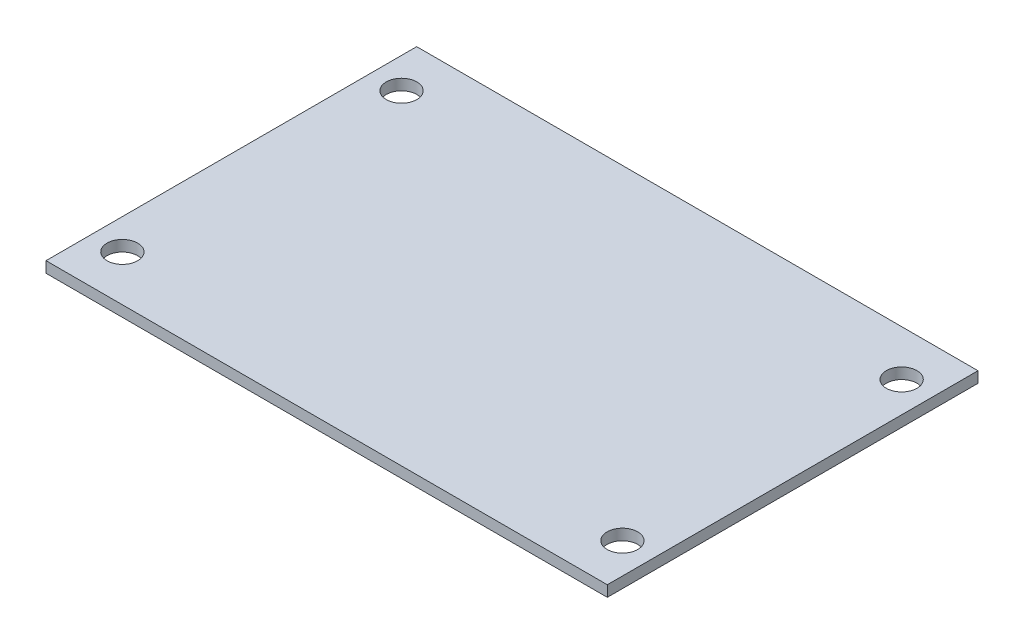
ISO-10303-21;
HEADER;
FILE_DESCRIPTION(('STEP AP214'),'2;1');
FILE_NAME('part.step','',(''),(''),'','','');
FILE_SCHEMA(('AUTOMOTIVE_DESIGN { 1 0 10303 214 1 1 1 1 }'));
ENDSEC;
DATA;
#1=APPLICATION_CONTEXT('core data for automotive mechanical design processes');
#2=APPLICATION_PROTOCOL_DEFINITION('international standard','automotive_design',2000,#1);
#3=PRODUCT_CONTEXT('',#1,'mechanical');
#4=PRODUCT('Part','Part','',(#3));
#5=PRODUCT_RELATED_PRODUCT_CATEGORY('part','',(#4));
#6=PRODUCT_DEFINITION_FORMATION('','',#4);
#7=PRODUCT_DEFINITION_CONTEXT('part definition',#1,'design');
#8=PRODUCT_DEFINITION('design','',#6,#7);
#9=PRODUCT_DEFINITION_SHAPE('','',#8);
#10=(LENGTH_UNIT() NAMED_UNIT(*) SI_UNIT(.MILLI.,.METRE.));
#11=(NAMED_UNIT(*) PLANE_ANGLE_UNIT() SI_UNIT($,.RADIAN.));
#12=(NAMED_UNIT(*) SI_UNIT($,.STERADIAN.) SOLID_ANGLE_UNIT());
#13=UNCERTAINTY_MEASURE_WITH_UNIT(LENGTH_MEASURE(1.E-05),#10,'distance_accuracy_value','');
#14=(GEOMETRIC_REPRESENTATION_CONTEXT(3) GLOBAL_UNCERTAINTY_ASSIGNED_CONTEXT((#13)) GLOBAL_UNIT_ASSIGNED_CONTEXT((#10,
#11,#12)) REPRESENTATION_CONTEXT('',''));
#15=CARTESIAN_POINT('',(0.,0.,0.));
#16=DIRECTION('',(0.,0.,1.));
#17=DIRECTION('',(1.,0.,0.));
#18=AXIS2_PLACEMENT_3D('',#15,#16,#17);
#19=CARTESIAN_POINT('',(38.5,1.5,-25.425));
#20=DIRECTION('',(-1.,0.,0.));
#21=DIRECTION('',(0.,0.,1.));
#22=AXIS2_PLACEMENT_3D('',#19,#20,#21);
#23=PLANE('',#22);
#24=DIRECTION('',(0.,0.,-1.));
#25=VECTOR('',#24,1.);
#26=CARTESIAN_POINT('',(38.5,0.,-25.425));
#27=LINE('',#26,#25);
#28=CARTESIAN_POINT('',(38.5,0.,25.425));
#29=VERTEX_POINT('',#28);
#30=CARTESIAN_POINT('',(38.5,0.,-25.425));
#31=VERTEX_POINT('',#30);
#32=EDGE_CURVE('E98',#29,#31,#27,.T.);
#33=ORIENTED_EDGE('',*,*,#32,.T.);
#34=DIRECTION('',(0.,-1.,0.));
#35=VECTOR('',#34,1.);
#36=CARTESIAN_POINT('',(38.5,1.5,-25.425));
#37=LINE('',#36,#35);
#38=CARTESIAN_POINT('',(38.5,1.5,-25.425));
#39=VERTEX_POINT('',#38);
#40=EDGE_CURVE('E11',#39,#31,#37,.T.);
#41=ORIENTED_EDGE('',*,*,#40,.F.);
#42=DIRECTION('',(0.,0.,-1.));
#43=VECTOR('',#42,1.);
#44=CARTESIAN_POINT('',(38.5,1.5,-25.425));
#45=LINE('',#44,#43);
#46=CARTESIAN_POINT('',(38.5,1.5,25.425));
#47=VERTEX_POINT('',#46);
#48=EDGE_CURVE('E86',#47,#39,#45,.T.);
#49=ORIENTED_EDGE('',*,*,#48,.F.);
#50=DIRECTION('',(0.,-1.,0.));
#51=VECTOR('',#50,1.);
#52=CARTESIAN_POINT('',(38.5,1.5,25.425));
#53=LINE('',#52,#51);
#54=EDGE_CURVE('E94',#47,#29,#53,.T.);
#55=ORIENTED_EDGE('',*,*,#54,.T.);
#56=EDGE_LOOP('',(#33,#41,#49,#55));
#57=FACE_BOUND('',#56,.T.);
#58=ADVANCED_FACE('F35',(#57),#23,.F.);
#59=CARTESIAN_POINT('',(-38.5,1.5,-25.425));
#60=DIRECTION('',(0.,0.,1.));
#61=DIRECTION('',(1.,0.,0.));
#62=AXIS2_PLACEMENT_3D('',#59,#60,#61);
#63=PLANE('',#62);
#64=DIRECTION('',(-1.,0.,0.));
#65=VECTOR('',#64,1.);
#66=CARTESIAN_POINT('',(-38.5,0.,-25.425));
#67=LINE('',#66,#65);
#68=CARTESIAN_POINT('',(-38.5,0.,-25.425));
#69=VERTEX_POINT('',#68);
#70=EDGE_CURVE('E90',#31,#69,#67,.T.);
#71=ORIENTED_EDGE('',*,*,#70,.T.);
#72=DIRECTION('',(0.,-1.,0.));
#73=VECTOR('',#72,1.);
#74=CARTESIAN_POINT('',(-38.5,1.5,-25.425));
#75=LINE('',#74,#73);
#76=CARTESIAN_POINT('',(-38.5,1.5,-25.425));
#77=VERTEX_POINT('',#76);
#78=EDGE_CURVE('E43',#77,#69,#75,.T.);
#79=ORIENTED_EDGE('',*,*,#78,.F.);
#80=DIRECTION('',(-1.,0.,0.));
#81=VECTOR('',#80,1.);
#82=CARTESIAN_POINT('',(-38.5,1.5,-25.425));
#83=LINE('',#82,#81);
#84=EDGE_CURVE('E81',#39,#77,#83,.T.);
#85=ORIENTED_EDGE('',*,*,#84,.F.);
#86=ORIENTED_EDGE('',*,*,#40,.T.);
#87=EDGE_LOOP('',(#71,#79,#85,#86));
#88=FACE_BOUND('',#87,.T.);
#89=ADVANCED_FACE('F89',(#88),#63,.F.);
#90=CARTESIAN_POINT('',(-38.5,1.5,-25.425));
#91=DIRECTION('',(1.,0.,0.));
#92=DIRECTION('',(0.,0.,-1.));
#93=AXIS2_PLACEMENT_3D('',#90,#91,#92);
#94=PLANE('',#93);
#95=DIRECTION('',(0.,0.,1.));
#96=VECTOR('',#95,1.);
#97=CARTESIAN_POINT('',(-38.5,0.,-25.425));
#98=LINE('',#97,#96);
#99=CARTESIAN_POINT('',(-38.5,0.,25.425));
#100=VERTEX_POINT('',#99);
#101=EDGE_CURVE('E68',#69,#100,#98,.T.);
#102=ORIENTED_EDGE('',*,*,#101,.T.);
#103=DIRECTION('',(0.,-1.,0.));
#104=VECTOR('',#103,1.);
#105=CARTESIAN_POINT('',(-38.5,1.5,25.425));
#106=LINE('',#105,#104);
#107=CARTESIAN_POINT('',(-38.5,1.5,25.425));
#108=VERTEX_POINT('',#107);
#109=EDGE_CURVE('E91',#108,#100,#106,.T.);
#110=ORIENTED_EDGE('',*,*,#109,.F.);
#111=DIRECTION('',(0.,0.,1.));
#112=VECTOR('',#111,1.);
#113=CARTESIAN_POINT('',(-38.5,1.5,-25.425));
#114=LINE('',#113,#112);
#115=EDGE_CURVE('E84',#77,#108,#114,.T.);
#116=ORIENTED_EDGE('',*,*,#115,.F.);
#117=ORIENTED_EDGE('',*,*,#78,.T.);
#118=EDGE_LOOP('',(#102,#110,#116,#117));
#119=FACE_BOUND('',#118,.T.);
#120=ADVANCED_FACE('F92',(#119),#94,.F.);
#121=CARTESIAN_POINT('',(-38.5,1.5,25.425));
#122=DIRECTION('',(0.,0.,-1.));
#123=DIRECTION('',(-1.,0.,0.));
#124=AXIS2_PLACEMENT_3D('',#121,#122,#123);
#125=PLANE('',#124);
#126=DIRECTION('',(1.,0.,0.));
#127=VECTOR('',#126,1.);
#128=CARTESIAN_POINT('',(-38.5,0.,25.425));
#129=LINE('',#128,#127);
#130=EDGE_CURVE('E74',#100,#29,#129,.T.);
#131=ORIENTED_EDGE('',*,*,#130,.T.);
#132=ORIENTED_EDGE('',*,*,#54,.F.);
#133=DIRECTION('',(1.,0.,0.));
#134=VECTOR('',#133,1.);
#135=CARTESIAN_POINT('',(-38.5,1.5,25.425));
#136=LINE('',#135,#134);
#137=EDGE_CURVE('E51',#108,#47,#136,.T.);
#138=ORIENTED_EDGE('',*,*,#137,.F.);
#139=ORIENTED_EDGE('',*,*,#109,.T.);
#140=EDGE_LOOP('',(#131,#132,#138,#139));
#141=FACE_BOUND('',#140,.T.);
#142=ADVANCED_FACE('F106',(#141),#125,.F.);
#143=CARTESIAN_POINT('',(0.,1.5,0.));
#144=DIRECTION('',(0.,1.,0.));
#145=DIRECTION('',(0.,0.,1.));
#146=AXIS2_PLACEMENT_3D('',#143,#144,#145);
#147=PLANE('',#146);
#148=CARTESIAN_POINT('',(-34.3,1.5,19.15));
#149=DIRECTION('',(0.,1.,0.));
#150=DIRECTION('',(0.,0.,1.));
#151=AXIS2_PLACEMENT_3D('',#148,#149,#150);
#152=CIRCLE('',#151,2.1);
#153=CARTESIAN_POINT('',(-34.3,1.5,21.25));
#154=VERTEX_POINT('',#153);
#155=EDGE_CURVE('E118',#154,#154,#152,.T.);
#156=ORIENTED_EDGE('',*,*,#155,.F.);
#157=EDGE_LOOP('',(#156));
#158=FACE_BOUND('',#157,.T.);
#159=CARTESIAN_POINT('',(34.3,1.5,19.15));
#160=DIRECTION('',(0.,1.,0.));
#161=DIRECTION('',(0.,0.,1.));
#162=AXIS2_PLACEMENT_3D('',#159,#160,#161);
#163=CIRCLE('',#162,2.1);
#164=CARTESIAN_POINT('',(34.3,1.5,21.25));
#165=VERTEX_POINT('',#164);
#166=EDGE_CURVE('E124',#165,#165,#163,.T.);
#167=ORIENTED_EDGE('',*,*,#166,.F.);
#168=EDGE_LOOP('',(#167));
#169=FACE_BOUND('',#168,.T.);
#170=CARTESIAN_POINT('',(34.3,1.5,-19.15));
#171=DIRECTION('',(0.,1.,0.));
#172=DIRECTION('',(0.,0.,1.));
#173=AXIS2_PLACEMENT_3D('',#170,#171,#172);
#174=CIRCLE('',#173,2.1);
#175=CARTESIAN_POINT('',(34.3,1.5,-17.05));
#176=VERTEX_POINT('',#175);
#177=EDGE_CURVE('E130',#176,#176,#174,.T.);
#178=ORIENTED_EDGE('',*,*,#177,.F.);
#179=EDGE_LOOP('',(#178));
#180=FACE_BOUND('',#179,.T.);
#181=CARTESIAN_POINT('',(-34.3,1.5,-19.15));
#182=DIRECTION('',(0.,1.,0.));
#183=DIRECTION('',(0.,0.,1.));
#184=AXIS2_PLACEMENT_3D('',#181,#182,#183);
#185=CIRCLE('',#184,2.1);
#186=CARTESIAN_POINT('',(-34.3,1.5,-17.05));
#187=VERTEX_POINT('',#186);
#188=EDGE_CURVE('E112',#187,#187,#185,.T.);
#189=ORIENTED_EDGE('',*,*,#188,.F.);
#190=EDGE_LOOP('',(#189));
#191=FACE_BOUND('',#190,.T.);
#192=ORIENTED_EDGE('',*,*,#48,.T.);
#193=ORIENTED_EDGE('',*,*,#84,.T.);
#194=ORIENTED_EDGE('',*,*,#115,.T.);
#195=ORIENTED_EDGE('',*,*,#137,.T.);
#196=EDGE_LOOP('',(#192,#193,#194,#195));
#197=FACE_BOUND('',#196,.T.);
#198=ADVANCED_FACE('F82',(#158,#169,#180,#191,#197),#147,.T.);
#199=CARTESIAN_POINT('',(0.,0.,0.));
#200=DIRECTION('',(0.,1.,0.));
#201=DIRECTION('',(0.,0.,1.));
#202=AXIS2_PLACEMENT_3D('',#199,#200,#201);
#203=PLANE('',#202);
#204=CARTESIAN_POINT('',(-34.3,0.,19.15));
#205=DIRECTION('',(0.,1.,0.));
#206=DIRECTION('',(0.,0.,1.));
#207=AXIS2_PLACEMENT_3D('',#204,#205,#206);
#208=CIRCLE('',#207,2.1);
#209=CARTESIAN_POINT('',(-34.3,0.,21.25));
#210=VERTEX_POINT('',#209);
#211=EDGE_CURVE('E121',#210,#210,#208,.T.);
#212=ORIENTED_EDGE('',*,*,#211,.T.);
#213=EDGE_LOOP('',(#212));
#214=FACE_BOUND('',#213,.T.);
#215=CARTESIAN_POINT('',(34.3,0.,19.15));
#216=DIRECTION('',(0.,1.,0.));
#217=DIRECTION('',(0.,0.,1.));
#218=AXIS2_PLACEMENT_3D('',#215,#216,#217);
#219=CIRCLE('',#218,2.1);
#220=CARTESIAN_POINT('',(34.3,0.,21.25));
#221=VERTEX_POINT('',#220);
#222=EDGE_CURVE('E127',#221,#221,#219,.T.);
#223=ORIENTED_EDGE('',*,*,#222,.T.);
#224=EDGE_LOOP('',(#223));
#225=FACE_BOUND('',#224,.T.);
#226=CARTESIAN_POINT('',(34.3,0.,-19.15));
#227=DIRECTION('',(0.,1.,0.));
#228=DIRECTION('',(0.,0.,1.));
#229=AXIS2_PLACEMENT_3D('',#226,#227,#228);
#230=CIRCLE('',#229,2.1);
#231=CARTESIAN_POINT('',(34.3,0.,-17.05));
#232=VERTEX_POINT('',#231);
#233=EDGE_CURVE('E115',#232,#232,#230,.T.);
#234=ORIENTED_EDGE('',*,*,#233,.T.);
#235=EDGE_LOOP('',(#234));
#236=FACE_BOUND('',#235,.T.);
#237=CARTESIAN_POINT('',(-34.3,0.,-19.15));
#238=DIRECTION('',(0.,1.,0.));
#239=DIRECTION('',(0.,0.,1.));
#240=AXIS2_PLACEMENT_3D('',#237,#238,#239);
#241=CIRCLE('',#240,2.1);
#242=CARTESIAN_POINT('',(-34.3,0.,-17.05));
#243=VERTEX_POINT('',#242);
#244=EDGE_CURVE('E101',#243,#243,#241,.T.);
#245=ORIENTED_EDGE('',*,*,#244,.T.);
#246=EDGE_LOOP('',(#245));
#247=FACE_BOUND('',#246,.T.);
#248=ORIENTED_EDGE('',*,*,#32,.F.);
#249=ORIENTED_EDGE('',*,*,#130,.F.);
#250=ORIENTED_EDGE('',*,*,#101,.F.);
#251=ORIENTED_EDGE('',*,*,#70,.F.);
#252=EDGE_LOOP('',(#248,#249,#250,#251));
#253=FACE_BOUND('',#252,.T.);
#254=ADVANCED_FACE('F109',(#214,#225,#236,#247,#253),#203,.F.);
#255=CARTESIAN_POINT('',(-34.3,0.,-19.15));
#256=DIRECTION('',(0.,1.,0.));
#257=DIRECTION('',(0.,0.,1.));
#258=AXIS2_PLACEMENT_3D('',#255,#256,#257);
#259=CYLINDRICAL_SURFACE('',#258,2.1);
#260=ORIENTED_EDGE('',*,*,#244,.F.);
#261=EDGE_LOOP('',(#260));
#262=FACE_BOUND('',#261,.T.);
#263=ORIENTED_EDGE('',*,*,#188,.T.);
#264=EDGE_LOOP('',(#263));
#265=FACE_BOUND('',#264,.T.);
#266=ADVANCED_FACE('F142',(#262,#265),#259,.F.);
#267=CARTESIAN_POINT('',(34.3,0.,-19.15));
#268=DIRECTION('',(0.,1.,0.));
#269=DIRECTION('',(0.,0.,1.));
#270=AXIS2_PLACEMENT_3D('',#267,#268,#269);
#271=CYLINDRICAL_SURFACE('',#270,2.1);
#272=ORIENTED_EDGE('',*,*,#233,.F.);
#273=EDGE_LOOP('',(#272));
#274=FACE_BOUND('',#273,.T.);
#275=ORIENTED_EDGE('',*,*,#177,.T.);
#276=EDGE_LOOP('',(#275));
#277=FACE_BOUND('',#276,.T.);
#278=ADVANCED_FACE('F138',(#274,#277),#271,.F.);
#279=CARTESIAN_POINT('',(34.3,0.,19.15));
#280=DIRECTION('',(0.,1.,0.));
#281=DIRECTION('',(0.,0.,1.));
#282=AXIS2_PLACEMENT_3D('',#279,#280,#281);
#283=CYLINDRICAL_SURFACE('',#282,2.1);
#284=ORIENTED_EDGE('',*,*,#222,.F.);
#285=EDGE_LOOP('',(#284));
#286=FACE_BOUND('',#285,.T.);
#287=ORIENTED_EDGE('',*,*,#166,.T.);
#288=EDGE_LOOP('',(#287));
#289=FACE_BOUND('',#288,.T.);
#290=ADVANCED_FACE('F141',(#286,#289),#283,.F.);
#291=CARTESIAN_POINT('',(-34.3,0.,19.15));
#292=DIRECTION('',(0.,1.,0.));
#293=DIRECTION('',(0.,0.,1.));
#294=AXIS2_PLACEMENT_3D('',#291,#292,#293);
#295=CYLINDRICAL_SURFACE('',#294,2.1);
#296=ORIENTED_EDGE('',*,*,#211,.F.);
#297=EDGE_LOOP('',(#296));
#298=FACE_BOUND('',#297,.T.);
#299=ORIENTED_EDGE('',*,*,#155,.T.);
#300=EDGE_LOOP('',(#299));
#301=FACE_BOUND('',#300,.T.);
#302=ADVANCED_FACE('F205',(#298,#301),#295,.F.);
#303=CLOSED_SHELL('',(#58,#89,#120,#142,#198,#254,#266,#278,#290,#302));
#304=MANIFOLD_SOLID_BREP('B2',#303);
#305=ADVANCED_BREP_SHAPE_REPRESENTATION('',(#18,#304),#14);
#306=SHAPE_DEFINITION_REPRESENTATION(#9,#305);
ENDSEC;
END-ISO-10303-21;
